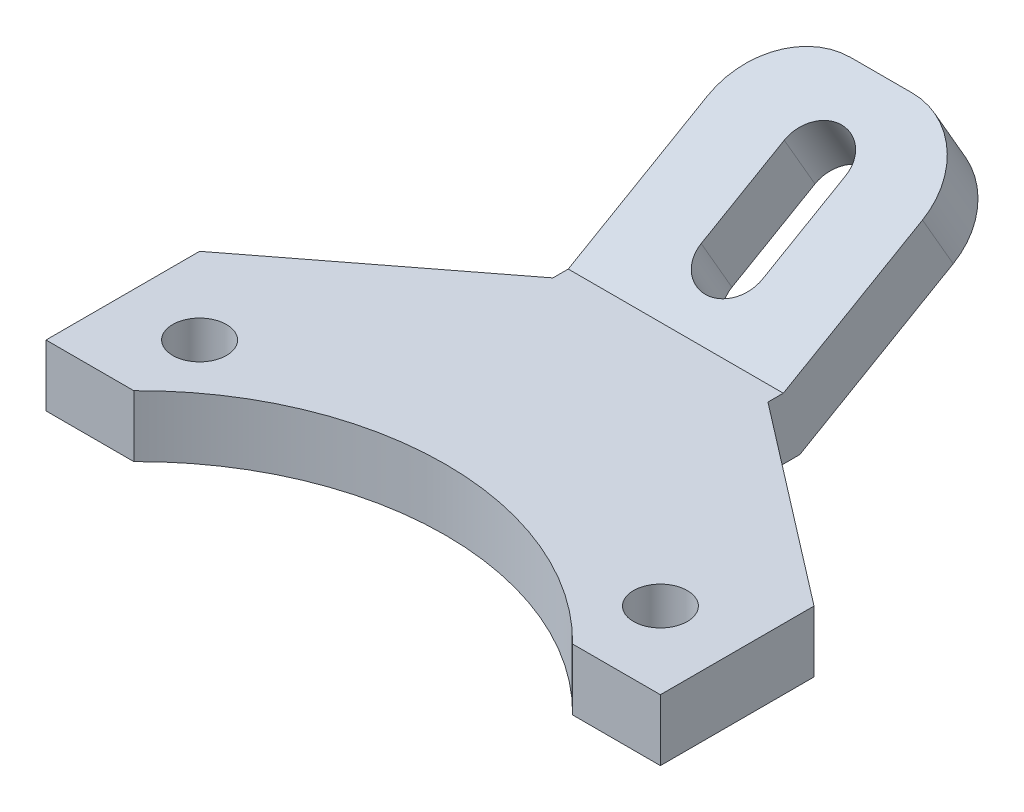
ISO-10303-21;
HEADER;
FILE_DESCRIPTION(('STEP AP214'),'2;1');
FILE_NAME('part.step','',(''),(''),'','','');
FILE_SCHEMA(('AUTOMOTIVE_DESIGN { 1 0 10303 214 1 1 1 1 }'));
ENDSEC;
DATA;
#1=APPLICATION_CONTEXT('core data for automotive mechanical design processes');
#2=APPLICATION_PROTOCOL_DEFINITION('international standard','automotive_design',2000,#1);
#3=PRODUCT_CONTEXT('',#1,'mechanical');
#4=PRODUCT('Part','Part','',(#3));
#5=PRODUCT_RELATED_PRODUCT_CATEGORY('part','',(#4));
#6=PRODUCT_DEFINITION_FORMATION('','',#4);
#7=PRODUCT_DEFINITION_CONTEXT('part definition',#1,'design');
#8=PRODUCT_DEFINITION('design','',#6,#7);
#9=PRODUCT_DEFINITION_SHAPE('','',#8);
#10=(LENGTH_UNIT() NAMED_UNIT(*) SI_UNIT(.MILLI.,.METRE.));
#11=(NAMED_UNIT(*) PLANE_ANGLE_UNIT() SI_UNIT($,.RADIAN.));
#12=(NAMED_UNIT(*) SI_UNIT($,.STERADIAN.) SOLID_ANGLE_UNIT());
#13=UNCERTAINTY_MEASURE_WITH_UNIT(LENGTH_MEASURE(1.E-05),#10,'distance_accuracy_value','');
#14=(GEOMETRIC_REPRESENTATION_CONTEXT(3) GLOBAL_UNCERTAINTY_ASSIGNED_CONTEXT((#13)) GLOBAL_UNIT_ASSIGNED_CONTEXT((#10,
#11,#12)) REPRESENTATION_CONTEXT('',''));
#15=CARTESIAN_POINT('',(0.,0.,0.));
#16=DIRECTION('',(0.,0.,1.));
#17=DIRECTION('',(1.,0.,0.));
#18=AXIS2_PLACEMENT_3D('',#15,#16,#17);
#19=CARTESIAN_POINT('',(27.,4.,0.));
#20=DIRECTION('',(-1.,0.,0.));
#21=DIRECTION('',(0.,0.,1.));
#22=AXIS2_PLACEMENT_3D('',#19,#20,#21);
#23=PLANE('',#22);
#24=DIRECTION('',(0.,-0.500000000000004,0.866025403784436));
#25=VECTOR('',#24,1.);
#26=CARTESIAN_POINT('',(27.,8.26794919243117,-36.3923048454132));
#27=LINE('',#26,#25);
#28=CARTESIAN_POINT('',(27.,5.76794919243115,-32.0621778264911));
#29=VERTEX_POINT('',#28);
#30=CARTESIAN_POINT('',(27.,0.,-22.0717967697245));
#31=VERTEX_POINT('',#30);
#32=EDGE_CURVE('E228',#29,#31,#27,.T.);
#33=ORIENTED_EDGE('',*,*,#32,.F.);
#34=DIRECTION('',(0.,0.866025403784436,0.500000000000004));
#35=VECTOR('',#34,1.);
#36=CARTESIAN_POINT('',(27.,9.2320508075689,-30.062177826491));
#37=LINE('',#36,#35);
#38=CARTESIAN_POINT('',(27.,9.2320508075689,-30.062177826491));
#39=VERTEX_POINT('',#38);
#40=EDGE_CURVE('E11',#29,#39,#37,.T.);
#41=ORIENTED_EDGE('',*,*,#40,.T.);
#42=DIRECTION('',(0.,-0.500000000000004,0.866025403784436));
#43=VECTOR('',#42,1.);
#44=CARTESIAN_POINT('',(27.,11.7320508075689,-34.3923048454132));
#45=LINE('',#44,#43);
#46=CARTESIAN_POINT('',(27.,4.,-21.));
#47=VERTEX_POINT('',#46);
#48=EDGE_CURVE('E225',#39,#47,#45,.T.);
#49=ORIENTED_EDGE('',*,*,#48,.T.);
#50=DIRECTION('',(0.,0.,-1.));
#51=VECTOR('',#50,1.);
#52=CARTESIAN_POINT('',(27.,4.,0.));
#53=LINE('',#52,#51);
#54=CARTESIAN_POINT('',(27.,4.,-20.));
#55=VERTEX_POINT('',#54);
#56=EDGE_CURVE('E258',#55,#47,#53,.T.);
#57=ORIENTED_EDGE('',*,*,#56,.F.);
#58=DIRECTION('',(0.,-1.,0.));
#59=VECTOR('',#58,1.);
#60=CARTESIAN_POINT('',(27.,4.,-20.));
#61=LINE('',#60,#59);
#62=CARTESIAN_POINT('',(27.,0.,-20.));
#63=VERTEX_POINT('',#62);
#64=EDGE_CURVE('E324',#55,#63,#61,.T.);
#65=ORIENTED_EDGE('',*,*,#64,.T.);
#66=DIRECTION('',(0.,0.,-1.));
#67=VECTOR('',#66,1.);
#68=CARTESIAN_POINT('',(27.,0.,0.));
#69=LINE('',#68,#67);
#70=EDGE_CURVE('E296',#63,#31,#69,.T.);
#71=ORIENTED_EDGE('',*,*,#70,.T.);
#72=EDGE_LOOP('',(#33,#41,#49,#57,#65,#71));
#73=FACE_BOUND('',#72,.T.);
#74=ADVANCED_FACE('F43',(#73),#23,.F.);
#75=CARTESIAN_POINT('',(13.,4.,0.));
#76=DIRECTION('',(-1.,0.,0.));
#77=DIRECTION('',(0.,0.,1.));
#78=AXIS2_PLACEMENT_3D('',#75,#76,#77);
#79=PLANE('',#78);
#80=DIRECTION('',(0.,-0.500000000000004,0.866025403784436));
#81=VECTOR('',#80,1.);
#82=CARTESIAN_POINT('',(13.,11.7320508075689,-34.3923048454132));
#83=LINE('',#82,#81);
#84=CARTESIAN_POINT('',(13.,9.2320508075689,-30.062177826491));
#85=VERTEX_POINT('',#84);
#86=CARTESIAN_POINT('',(13.,4.,-21.));
#87=VERTEX_POINT('',#86);
#88=EDGE_CURVE('E221',#85,#87,#83,.T.);
#89=ORIENTED_EDGE('',*,*,#88,.F.);
#90=DIRECTION('',(0.,-0.866025403784436,-0.500000000000004));
#91=VECTOR('',#90,1.);
#92=CARTESIAN_POINT('',(13.,18.3253175473056,-24.812177826491));
#93=LINE('',#92,#91);
#94=CARTESIAN_POINT('',(13.,5.76794919243115,-32.0621778264911));
#95=VERTEX_POINT('',#94);
#96=EDGE_CURVE('E356',#85,#95,#93,.T.);
#97=ORIENTED_EDGE('',*,*,#96,.T.);
#98=DIRECTION('',(0.,-0.500000000000004,0.866025403784436));
#99=VECTOR('',#98,1.);
#100=CARTESIAN_POINT('',(13.,8.26794919243117,-36.3923048454132));
#101=LINE('',#100,#99);
#102=CARTESIAN_POINT('',(13.,0.,-22.0717967697245));
#103=VERTEX_POINT('',#102);
#104=EDGE_CURVE('E220',#95,#103,#101,.T.);
#105=ORIENTED_EDGE('',*,*,#104,.T.);
#106=DIRECTION('',(0.,0.,-1.));
#107=VECTOR('',#106,1.);
#108=CARTESIAN_POINT('',(13.,0.,0.));
#109=LINE('',#108,#107);
#110=CARTESIAN_POINT('',(13.,0.,-20.));
#111=VERTEX_POINT('',#110);
#112=EDGE_CURVE('E300',#111,#103,#109,.T.);
#113=ORIENTED_EDGE('',*,*,#112,.F.);
#114=DIRECTION('',(0.,-1.,0.));
#115=VECTOR('',#114,1.);
#116=CARTESIAN_POINT('',(13.,4.,-20.));
#117=LINE('',#116,#115);
#118=CARTESIAN_POINT('',(13.,4.,-20.));
#119=VERTEX_POINT('',#118);
#120=EDGE_CURVE('E321',#119,#111,#117,.T.);
#121=ORIENTED_EDGE('',*,*,#120,.F.);
#122=DIRECTION('',(0.,0.,-1.));
#123=VECTOR('',#122,1.);
#124=CARTESIAN_POINT('',(13.,4.,0.));
#125=LINE('',#124,#123);
#126=EDGE_CURVE('E262',#119,#87,#125,.T.);
#127=ORIENTED_EDGE('',*,*,#126,.T.);
#128=EDGE_LOOP('',(#89,#97,#105,#113,#121,#127));
#129=FACE_BOUND('',#128,.T.);
#130=ADVANCED_FACE('F379',(#129),#79,.T.);
#131=CARTESIAN_POINT('',(0.,0.,0.));
#132=DIRECTION('',(0.,1.,0.));
#133=DIRECTION('',(0.,0.,1.));
#134=AXIS2_PLACEMENT_3D('',#131,#132,#133);
#135=PLANE('',#134);
#136=CARTESIAN_POINT('',(5.,0.,-5.));
#137=DIRECTION('',(0.,1.,0.));
#138=DIRECTION('',(0.,0.,1.));
#139=AXIS2_PLACEMENT_3D('',#136,#137,#138);
#140=CIRCLE('',#139,1.75);
#141=CARTESIAN_POINT('',(5.,0.,-3.25));
#142=VERTEX_POINT('',#141);
#143=EDGE_CURVE('E276',#142,#142,#140,.T.);
#144=ORIENTED_EDGE('',*,*,#143,.T.);
#145=EDGE_LOOP('',(#144));
#146=FACE_BOUND('',#145,.T.);
#147=CARTESIAN_POINT('',(35.,0.,-5.));
#148=DIRECTION('',(0.,1.,0.));
#149=DIRECTION('',(0.,0.,1.));
#150=AXIS2_PLACEMENT_3D('',#147,#148,#149);
#151=CIRCLE('',#150,1.75);
#152=CARTESIAN_POINT('',(35.,0.,-3.25));
#153=VERTEX_POINT('',#152);
#154=EDGE_CURVE('E224',#153,#153,#151,.T.);
#155=ORIENTED_EDGE('',*,*,#154,.T.);
#156=EDGE_LOOP('',(#155));
#157=FACE_BOUND('',#156,.T.);
#158=DIRECTION('',(-1.,0.,0.));
#159=VECTOR('',#158,1.);
#160=CARTESIAN_POINT('',(0.,0.,-22.0717967697245));
#161=LINE('',#160,#159);
#162=EDGE_CURVE('E341',#31,#103,#161,.T.);
#163=ORIENTED_EDGE('',*,*,#162,.F.);
#164=ORIENTED_EDGE('',*,*,#70,.F.);
#165=DIRECTION('',(0.7926239891046,0.,0.609710760849692));
#166=VECTOR('',#165,1.);
#167=CARTESIAN_POINT('',(19.7026022304833,0.,-25.6133828996283));
#168=LINE('',#167,#166);
#169=CARTESIAN_POINT('',(40.,0.,-10.));
#170=VERTEX_POINT('',#169);
#171=EDGE_CURVE('E292',#63,#170,#168,.T.);
#172=ORIENTED_EDGE('',*,*,#171,.T.);
#173=DIRECTION('',(0.,0.,-1.));
#174=VECTOR('',#173,1.);
#175=CARTESIAN_POINT('',(40.,0.,0.));
#176=LINE('',#175,#174);
#177=CARTESIAN_POINT('',(40.,0.,0.));
#178=VERTEX_POINT('',#177);
#179=EDGE_CURVE('E288',#178,#170,#176,.T.);
#180=ORIENTED_EDGE('',*,*,#179,.F.);
#181=DIRECTION('',(1.,0.,0.));
#182=VECTOR('',#181,1.);
#183=CARTESIAN_POINT('',(0.,0.,0.));
#184=LINE('',#183,#182);
#185=CARTESIAN_POINT('',(34.2828568570857,0.,0.));
#186=VERTEX_POINT('',#185);
#187=EDGE_CURVE('E284',#186,#178,#184,.T.);
#188=ORIENTED_EDGE('',*,*,#187,.F.);
#189=CARTESIAN_POINT('',(20.,0.,14.));
#190=DIRECTION('',(0.,1.,0.));
#191=DIRECTION('',(0.,0.,1.));
#192=AXIS2_PLACEMENT_3D('',#189,#190,#191);
#193=CIRCLE('',#192,20.);
#194=CARTESIAN_POINT('',(5.71714314291429,0.,0.));
#195=VERTEX_POINT('',#194);
#196=EDGE_CURVE('E280',#186,#195,#193,.T.);
#197=ORIENTED_EDGE('',*,*,#196,.T.);
#198=CARTESIAN_POINT('',(0.,0.,0.));
#199=VERTEX_POINT('',#198);
#200=EDGE_CURVE('E238',#199,#195,#184,.T.);
#201=ORIENTED_EDGE('',*,*,#200,.F.);
#202=DIRECTION('',(0.,0.,-1.));
#203=VECTOR('',#202,1.);
#204=CARTESIAN_POINT('',(0.,0.,0.));
#205=LINE('',#204,#203);
#206=CARTESIAN_POINT('',(0.,0.,-10.));
#207=VERTEX_POINT('',#206);
#208=EDGE_CURVE('E308',#199,#207,#205,.T.);
#209=ORIENTED_EDGE('',*,*,#208,.T.);
#210=DIRECTION('',(-0.7926239891046,0.,0.609710760849692));
#211=VECTOR('',#210,1.);
#212=CARTESIAN_POINT('',(-4.83271375464684,0.,-6.28252788104089));
#213=LINE('',#212,#211);
#214=EDGE_CURVE('E304',#111,#207,#213,.T.);
#215=ORIENTED_EDGE('',*,*,#214,.F.);
#216=ORIENTED_EDGE('',*,*,#112,.T.);
#217=EDGE_LOOP('',(#163,#164,#172,#180,#188,#197,#201,#209,#215,#216));
#218=FACE_BOUND('',#217,.T.);
#219=ADVANCED_FACE('F395',(#146,#157,#218),#135,.F.);
#220=CARTESIAN_POINT('',(20.,4.,14.));
#221=DIRECTION('',(0.,-1.,0.));
#222=DIRECTION('',(0.,0.,-1.));
#223=AXIS2_PLACEMENT_3D('',#220,#221,#222);
#224=CYLINDRICAL_SURFACE('',#223,20.);
#225=ORIENTED_EDGE('',*,*,#196,.F.);
#226=DIRECTION('',(0.,-1.,0.));
#227=VECTOR('',#226,1.);
#228=CARTESIAN_POINT('',(34.2828568570857,4.,0.));
#229=LINE('',#228,#227);
#230=CARTESIAN_POINT('',(34.2828568570857,4.,0.));
#231=VERTEX_POINT('',#230);
#232=EDGE_CURVE('E334',#231,#186,#229,.T.);
#233=ORIENTED_EDGE('',*,*,#232,.F.);
#234=CARTESIAN_POINT('',(20.,4.,14.));
#235=DIRECTION('',(0.,1.,0.));
#236=DIRECTION('',(0.,0.,1.));
#237=AXIS2_PLACEMENT_3D('',#234,#235,#236);
#238=CIRCLE('',#237,20.);
#239=CARTESIAN_POINT('',(5.71714314291429,4.,0.));
#240=VERTEX_POINT('',#239);
#241=EDGE_CURVE('E242',#231,#240,#238,.T.);
#242=ORIENTED_EDGE('',*,*,#241,.T.);
#243=DIRECTION('',(0.,-1.,0.));
#244=VECTOR('',#243,1.);
#245=CARTESIAN_POINT('',(5.71714314291429,4.,0.));
#246=LINE('',#245,#244);
#247=EDGE_CURVE('E312',#240,#195,#246,.T.);
#248=ORIENTED_EDGE('',*,*,#247,.T.);
#249=EDGE_LOOP('',(#225,#233,#242,#248));
#250=FACE_BOUND('',#249,.T.);
#251=ADVANCED_FACE('F408',(#250),#224,.F.);
#252=CARTESIAN_POINT('',(0.,4.,0.));
#253=DIRECTION('',(0.,0.,-1.));
#254=DIRECTION('',(-1.,0.,0.));
#255=AXIS2_PLACEMENT_3D('',#252,#253,#254);
#256=PLANE('',#255);
#257=ORIENTED_EDGE('',*,*,#187,.T.);
#258=DIRECTION('',(0.,-1.,0.));
#259=VECTOR('',#258,1.);
#260=CARTESIAN_POINT('',(40.,4.,0.));
#261=LINE('',#260,#259);
#262=CARTESIAN_POINT('',(40.,4.,0.));
#263=VERTEX_POINT('',#262);
#264=EDGE_CURVE('E330',#263,#178,#261,.T.);
#265=ORIENTED_EDGE('',*,*,#264,.F.);
#266=DIRECTION('',(1.,0.,0.));
#267=VECTOR('',#266,1.);
#268=CARTESIAN_POINT('',(0.,4.,0.));
#269=LINE('',#268,#267);
#270=EDGE_CURVE('E246',#231,#263,#269,.T.);
#271=ORIENTED_EDGE('',*,*,#270,.F.);
#272=ORIENTED_EDGE('',*,*,#232,.T.);
#273=EDGE_LOOP('',(#257,#265,#271,#272));
#274=FACE_BOUND('',#273,.T.);
#275=ADVANCED_FACE('F431',(#274),#256,.F.);
#276=CARTESIAN_POINT('',(40.,4.,0.));
#277=DIRECTION('',(-1.,0.,0.));
#278=DIRECTION('',(0.,0.,1.));
#279=AXIS2_PLACEMENT_3D('',#276,#277,#278);
#280=PLANE('',#279);
#281=ORIENTED_EDGE('',*,*,#179,.T.);
#282=DIRECTION('',(0.,-1.,0.));
#283=VECTOR('',#282,1.);
#284=CARTESIAN_POINT('',(40.,4.,-10.));
#285=LINE('',#284,#283);
#286=CARTESIAN_POINT('',(40.,4.,-10.));
#287=VERTEX_POINT('',#286);
#288=EDGE_CURVE('E327',#287,#170,#285,.T.);
#289=ORIENTED_EDGE('',*,*,#288,.F.);
#290=DIRECTION('',(0.,0.,-1.));
#291=VECTOR('',#290,1.);
#292=CARTESIAN_POINT('',(40.,4.,0.));
#293=LINE('',#292,#291);
#294=EDGE_CURVE('E250',#263,#287,#293,.T.);
#295=ORIENTED_EDGE('',*,*,#294,.F.);
#296=ORIENTED_EDGE('',*,*,#264,.T.);
#297=EDGE_LOOP('',(#281,#289,#295,#296));
#298=FACE_BOUND('',#297,.T.);
#299=ADVANCED_FACE('F401',(#298),#280,.F.);
#300=CARTESIAN_POINT('',(19.7026022304833,4.,-25.6133828996283));
#301=DIRECTION('',(0.609710760849692,0.,-0.7926239891046));
#302=DIRECTION('',(-0.7926239891046,0.,-0.609710760849692));
#303=AXIS2_PLACEMENT_3D('',#300,#301,#302);
#304=PLANE('',#303);
#305=ORIENTED_EDGE('',*,*,#171,.F.);
#306=ORIENTED_EDGE('',*,*,#64,.F.);
#307=DIRECTION('',(0.7926239891046,0.,0.609710760849692));
#308=VECTOR('',#307,1.);
#309=CARTESIAN_POINT('',(19.7026022304833,4.,-25.6133828996283));
#310=LINE('',#309,#308);
#311=EDGE_CURVE('E254',#55,#287,#310,.T.);
#312=ORIENTED_EDGE('',*,*,#311,.T.);
#313=ORIENTED_EDGE('',*,*,#288,.T.);
#314=EDGE_LOOP('',(#305,#306,#312,#313));
#315=FACE_BOUND('',#314,.T.);
#316=ADVANCED_FACE('F397',(#315),#304,.T.);
#317=CARTESIAN_POINT('',(-4.83271375464684,4.,-6.28252788104089));
#318=DIRECTION('',(0.609710760849692,0.,0.7926239891046));
#319=DIRECTION('',(0.7926239891046,0.,-0.609710760849692));
#320=AXIS2_PLACEMENT_3D('',#317,#318,#319);
#321=PLANE('',#320);
#322=ORIENTED_EDGE('',*,*,#214,.T.);
#323=DIRECTION('',(0.,-1.,0.));
#324=VECTOR('',#323,1.);
#325=CARTESIAN_POINT('',(0.,4.,-10.));
#326=LINE('',#325,#324);
#327=CARTESIAN_POINT('',(0.,4.,-10.));
#328=VERTEX_POINT('',#327);
#329=EDGE_CURVE('E318',#328,#207,#326,.T.);
#330=ORIENTED_EDGE('',*,*,#329,.F.);
#331=DIRECTION('',(-0.7926239891046,0.,0.609710760849692));
#332=VECTOR('',#331,1.);
#333=CARTESIAN_POINT('',(-4.83271375464684,4.,-6.28252788104089));
#334=LINE('',#333,#332);
#335=EDGE_CURVE('E266',#119,#328,#334,.T.);
#336=ORIENTED_EDGE('',*,*,#335,.F.);
#337=ORIENTED_EDGE('',*,*,#120,.T.);
#338=EDGE_LOOP('',(#322,#330,#336,#337));
#339=FACE_BOUND('',#338,.T.);
#340=ADVANCED_FACE('F430',(#339),#321,.F.);
#341=CARTESIAN_POINT('',(0.,4.,0.));
#342=DIRECTION('',(-1.,0.,0.));
#343=DIRECTION('',(0.,0.,1.));
#344=AXIS2_PLACEMENT_3D('',#341,#342,#343);
#345=PLANE('',#344);
#346=ORIENTED_EDGE('',*,*,#208,.F.);
#347=DIRECTION('',(0.,-1.,0.));
#348=VECTOR('',#347,1.);
#349=CARTESIAN_POINT('',(0.,4.,0.));
#350=LINE('',#349,#348);
#351=CARTESIAN_POINT('',(0.,4.,0.));
#352=VERTEX_POINT('',#351);
#353=EDGE_CURVE('E315',#352,#199,#350,.T.);
#354=ORIENTED_EDGE('',*,*,#353,.F.);
#355=DIRECTION('',(0.,0.,-1.));
#356=VECTOR('',#355,1.);
#357=CARTESIAN_POINT('',(0.,4.,0.));
#358=LINE('',#357,#356);
#359=EDGE_CURVE('E269',#352,#328,#358,.T.);
#360=ORIENTED_EDGE('',*,*,#359,.T.);
#361=ORIENTED_EDGE('',*,*,#329,.T.);
#362=EDGE_LOOP('',(#346,#354,#360,#361));
#363=FACE_BOUND('',#362,.T.);
#364=ADVANCED_FACE('F426',(#363),#345,.T.);
#365=CARTESIAN_POINT('',(5.,4.,-5.));
#366=DIRECTION('',(0.,-1.,0.));
#367=DIRECTION('',(0.,0.,-1.));
#368=AXIS2_PLACEMENT_3D('',#365,#366,#367);
#369=CYLINDRICAL_SURFACE('',#368,1.75);
#370=CARTESIAN_POINT('',(5.,4.,-5.));
#371=DIRECTION('',(0.,1.,0.));
#372=DIRECTION('',(0.,0.,1.));
#373=AXIS2_PLACEMENT_3D('',#370,#371,#372);
#374=CIRCLE('',#373,1.75);
#375=CARTESIAN_POINT('',(5.,4.,-3.25));
#376=VERTEX_POINT('',#375);
#377=EDGE_CURVE('E237',#376,#376,#374,.T.);
#378=ORIENTED_EDGE('',*,*,#377,.T.);
#379=EDGE_LOOP('',(#378));
#380=FACE_BOUND('',#379,.T.);
#381=ORIENTED_EDGE('',*,*,#143,.F.);
#382=EDGE_LOOP('',(#381));
#383=FACE_BOUND('',#382,.T.);
#384=ADVANCED_FACE('F454',(#380,#383),#369,.F.);
#385=CARTESIAN_POINT('',(35.,4.,-5.));
#386=DIRECTION('',(0.,-1.,0.));
#387=DIRECTION('',(0.,0.,-1.));
#388=AXIS2_PLACEMENT_3D('',#385,#386,#387);
#389=CYLINDRICAL_SURFACE('',#388,1.75);
#390=CARTESIAN_POINT('',(35.,4.,-5.));
#391=DIRECTION('',(0.,1.,0.));
#392=DIRECTION('',(0.,0.,1.));
#393=AXIS2_PLACEMENT_3D('',#390,#391,#392);
#394=CIRCLE('',#393,1.75);
#395=CARTESIAN_POINT('',(35.,4.,-3.25));
#396=VERTEX_POINT('',#395);
#397=EDGE_CURVE('E233',#396,#396,#394,.T.);
#398=ORIENTED_EDGE('',*,*,#397,.T.);
#399=EDGE_LOOP('',(#398));
#400=FACE_BOUND('',#399,.T.);
#401=ORIENTED_EDGE('',*,*,#154,.F.);
#402=EDGE_LOOP('',(#401));
#403=FACE_BOUND('',#402,.T.);
#404=ADVANCED_FACE('F443',(#400,#403),#389,.F.);
#405=ORIENTED_EDGE('',*,*,#200,.T.);
#406=ORIENTED_EDGE('',*,*,#247,.F.);
#407=EDGE_CURVE('E251',#352,#240,#269,.T.);
#408=ORIENTED_EDGE('',*,*,#407,.F.);
#409=ORIENTED_EDGE('',*,*,#353,.T.);
#410=EDGE_LOOP('',(#405,#406,#408,#409));
#411=FACE_BOUND('',#410,.T.);
#412=ADVANCED_FACE('F415',(#411),#256,.F.);
#413=CARTESIAN_POINT('',(0.,4.,0.));
#414=DIRECTION('',(0.,1.,0.));
#415=DIRECTION('',(0.,0.,1.));
#416=AXIS2_PLACEMENT_3D('',#413,#414,#415);
#417=PLANE('',#416);
#418=DIRECTION('',(1.,0.,0.));
#419=VECTOR('',#418,1.);
#420=CARTESIAN_POINT('',(0.,4.,-21.));
#421=LINE('',#420,#419);
#422=EDGE_CURVE('E337',#87,#47,#421,.T.);
#423=ORIENTED_EDGE('',*,*,#422,.F.);
#424=ORIENTED_EDGE('',*,*,#126,.F.);
#425=ORIENTED_EDGE('',*,*,#335,.T.);
#426=ORIENTED_EDGE('',*,*,#359,.F.);
#427=ORIENTED_EDGE('',*,*,#407,.T.);
#428=ORIENTED_EDGE('',*,*,#241,.F.);
#429=ORIENTED_EDGE('',*,*,#270,.T.);
#430=ORIENTED_EDGE('',*,*,#294,.T.);
#431=ORIENTED_EDGE('',*,*,#311,.F.);
#432=ORIENTED_EDGE('',*,*,#56,.T.);
#433=EDGE_LOOP('',(#423,#424,#425,#426,#427,#428,#429,#430,#431,#432));
#434=FACE_BOUND('',#433,.T.);
#435=ORIENTED_EDGE('',*,*,#397,.F.);
#436=EDGE_LOOP('',(#435));
#437=FACE_BOUND('',#436,.T.);
#438=ORIENTED_EDGE('',*,*,#377,.F.);
#439=EDGE_LOOP('',(#438));
#440=FACE_BOUND('',#439,.T.);
#441=ADVANCED_FACE('F421',(#434,#437,#440),#417,.T.);
#442=CARTESIAN_POINT('',(13.,11.7320508075689,-34.3923048454132));
#443=DIRECTION('',(0.,0.866025403784436,0.500000000000004));
#444=DIRECTION('',(0.,-0.500000000000004,0.866025403784436));
#445=AXIS2_PLACEMENT_3D('',#442,#443,#444);
#446=PLANE('',#445);
#447=CARTESIAN_POINT('',(20.,6.11050204627201,-24.6554967736212));
#448=DIRECTION('',(0.,0.866025403784436,0.500000000000004));
#449=DIRECTION('',(0.,-0.500000000000004,0.866025403784436));
#450=AXIS2_PLACEMENT_3D('',#447,#448,#449);
#451=CIRCLE('',#450,2.);
#452=CARTESIAN_POINT('',(18.,6.11050204627201,-24.6554967736212));
#453=VERTEX_POINT('',#452);
#454=CARTESIAN_POINT('',(22.,6.110502046272,-24.6554967736212));
#455=VERTEX_POINT('',#454);
#456=EDGE_CURVE('E194',#453,#455,#451,.T.);
#457=ORIENTED_EDGE('',*,*,#456,.F.);
#458=DIRECTION('',(0.,-0.500000000000004,0.866025403784436));
#459=VECTOR('',#458,1.);
#460=CARTESIAN_POINT('',(18.,6.11050204627201,-24.6554967736212));
#461=LINE('',#460,#459);
#462=CARTESIAN_POINT('',(18.,9.2320508075689,-30.062177826491));
#463=VERTEX_POINT('',#462);
#464=EDGE_CURVE('E199',#463,#453,#461,.T.);
#465=ORIENTED_EDGE('',*,*,#464,.F.);
#466=CARTESIAN_POINT('',(20.,9.2320508075689,-30.062177826491));
#467=DIRECTION('',(0.,0.866025403784436,0.500000000000004));
#468=DIRECTION('',(0.,-0.500000000000004,0.866025403784436));
#469=AXIS2_PLACEMENT_3D('',#466,#467,#468);
#470=CIRCLE('',#469,2.);
#471=CARTESIAN_POINT('',(22.,9.2320508075689,-30.062177826491));
#472=VERTEX_POINT('',#471);
#473=EDGE_CURVE('E176',#472,#463,#470,.T.);
#474=ORIENTED_EDGE('',*,*,#473,.F.);
#475=DIRECTION('',(0.,0.500000000000004,-0.866025403784436));
#476=VECTOR('',#475,1.);
#477=CARTESIAN_POINT('',(22.,6.11050204627201,-24.6554967736212));
#478=LINE('',#477,#476);
#479=EDGE_CURVE('E188',#455,#472,#478,.T.);
#480=ORIENTED_EDGE('',*,*,#479,.F.);
#481=EDGE_LOOP('',(#457,#465,#474,#480));
#482=FACE_BOUND('',#481,.T.);
#483=DIRECTION('',(-1.,0.,0.));
#484=VECTOR('',#483,1.);
#485=CARTESIAN_POINT('',(13.,11.7320508075689,-34.3923048454132));
#486=LINE('',#485,#484);
#487=CARTESIAN_POINT('',(22.,11.7320508075689,-34.3923048454132));
#488=VERTEX_POINT('',#487);
#489=CARTESIAN_POINT('',(18.,11.7320508075689,-34.3923048454132));
#490=VERTEX_POINT('',#489);
#491=EDGE_CURVE('E217',#488,#490,#486,.T.);
#492=ORIENTED_EDGE('',*,*,#491,.T.);
#493=CARTESIAN_POINT('',(18.,9.2320508075689,-30.062177826491));
#494=DIRECTION('',(0.,0.866025403784436,0.500000000000004));
#495=DIRECTION('',(0.,-0.500000000000004,0.866025403784436));
#496=AXIS2_PLACEMENT_3D('',#493,#494,#495);
#497=CIRCLE('',#496,5.);
#498=EDGE_CURVE('E52',#490,#85,#497,.T.);
#499=ORIENTED_EDGE('',*,*,#498,.T.);
#500=ORIENTED_EDGE('',*,*,#88,.T.);
#501=ORIENTED_EDGE('',*,*,#422,.T.);
#502=ORIENTED_EDGE('',*,*,#48,.F.);
#503=CARTESIAN_POINT('',(22.,9.2320508075689,-30.062177826491));
#504=DIRECTION('',(0.,0.866025403784436,0.500000000000004));
#505=DIRECTION('',(0.,-0.500000000000004,0.866025403784436));
#506=AXIS2_PLACEMENT_3D('',#503,#504,#505);
#507=CIRCLE('',#506,5.);
#508=EDGE_CURVE('E59',#39,#488,#507,.T.);
#509=ORIENTED_EDGE('',*,*,#508,.T.);
#510=EDGE_LOOP('',(#492,#499,#500,#501,#502,#509));
#511=FACE_BOUND('',#510,.T.);
#512=ADVANCED_FACE('F196',(#482,#511),#446,.T.);
#513=CARTESIAN_POINT('',(13.,8.26794919243117,-36.3923048454132));
#514=DIRECTION('',(0.,-0.866025403784436,-0.500000000000004));
#515=DIRECTION('',(0.,0.500000000000004,-0.866025403784436));
#516=AXIS2_PLACEMENT_3D('',#513,#514,#515);
#517=PLANE('',#516);
#518=CARTESIAN_POINT('',(20.,2.64640043113426,-26.6554967736212));
#519=DIRECTION('',(0.,-0.866025403784436,-0.500000000000004));
#520=DIRECTION('',(0.,0.500000000000004,-0.866025403784436));
#521=AXIS2_PLACEMENT_3D('',#518,#519,#520);
#522=CIRCLE('',#521,2.);
#523=CARTESIAN_POINT('',(22.,2.64640043113426,-26.6554967736212));
#524=VERTEX_POINT('',#523);
#525=CARTESIAN_POINT('',(18.,2.64640043113426,-26.6554967736212));
#526=VERTEX_POINT('',#525);
#527=EDGE_CURVE('E353',#524,#526,#522,.T.);
#528=ORIENTED_EDGE('',*,*,#527,.F.);
#529=DIRECTION('',(0.,-0.500000000000004,0.866025403784436));
#530=VECTOR('',#529,1.);
#531=CARTESIAN_POINT('',(22.,8.26794919243117,-36.3923048454132));
#532=LINE('',#531,#530);
#533=CARTESIAN_POINT('',(22.,5.76794919243116,-32.0621778264911));
#534=VERTEX_POINT('',#533);
#535=EDGE_CURVE('E345',#534,#524,#532,.T.);
#536=ORIENTED_EDGE('',*,*,#535,.F.);
#537=CARTESIAN_POINT('',(20.,5.76794919243116,-32.0621778264911));
#538=DIRECTION('',(0.,-0.866025403784436,-0.500000000000004));
#539=DIRECTION('',(0.,0.500000000000004,-0.866025403784436));
#540=AXIS2_PLACEMENT_3D('',#537,#538,#539);
#541=CIRCLE('',#540,2.);
#542=CARTESIAN_POINT('',(18.,5.76794919243116,-32.0621778264911));
#543=VERTEX_POINT('',#542);
#544=EDGE_CURVE('E179',#543,#534,#541,.T.);
#545=ORIENTED_EDGE('',*,*,#544,.F.);
#546=DIRECTION('',(0.,0.500000000000004,-0.866025403784436));
#547=VECTOR('',#546,1.);
#548=CARTESIAN_POINT('',(18.,8.26794919243117,-36.3923048454132));
#549=LINE('',#548,#547);
#550=EDGE_CURVE('E350',#526,#543,#549,.T.);
#551=ORIENTED_EDGE('',*,*,#550,.F.);
#552=EDGE_LOOP('',(#528,#536,#545,#551));
#553=FACE_BOUND('',#552,.T.);
#554=ORIENTED_EDGE('',*,*,#104,.F.);
#555=CARTESIAN_POINT('',(18.,5.76794919243115,-32.0621778264911));
#556=DIRECTION('',(0.,-0.866025403784436,-0.500000000000004));
#557=DIRECTION('',(0.,0.500000000000004,-0.866025403784436));
#558=AXIS2_PLACEMENT_3D('',#555,#556,#557);
#559=CIRCLE('',#558,5.);
#560=CARTESIAN_POINT('',(18.,8.26794919243117,-36.3923048454132));
#561=VERTEX_POINT('',#560);
#562=EDGE_CURVE('E363',#95,#561,#559,.T.);
#563=ORIENTED_EDGE('',*,*,#562,.T.);
#564=DIRECTION('',(1.,0.,0.));
#565=VECTOR('',#564,1.);
#566=CARTESIAN_POINT('',(13.,8.26794919243117,-36.3923048454132));
#567=LINE('',#566,#565);
#568=CARTESIAN_POINT('',(22.,8.26794919243117,-36.3923048454132));
#569=VERTEX_POINT('',#568);
#570=EDGE_CURVE('E209',#561,#569,#567,.T.);
#571=ORIENTED_EDGE('',*,*,#570,.T.);
#572=CARTESIAN_POINT('',(22.,5.76794919243115,-32.0621778264911));
#573=DIRECTION('',(0.,-0.866025403784436,-0.500000000000004));
#574=DIRECTION('',(0.,0.500000000000004,-0.866025403784436));
#575=AXIS2_PLACEMENT_3D('',#572,#573,#574);
#576=CIRCLE('',#575,5.);
#577=EDGE_CURVE('E360',#569,#29,#576,.T.);
#578=ORIENTED_EDGE('',*,*,#577,.T.);
#579=ORIENTED_EDGE('',*,*,#32,.T.);
#580=ORIENTED_EDGE('',*,*,#162,.T.);
#581=EDGE_LOOP('',(#554,#563,#571,#578,#579,#580));
#582=FACE_BOUND('',#581,.T.);
#583=ADVANCED_FACE('F384',(#553,#582),#517,.T.);
#584=CARTESIAN_POINT('',(0.,17.8253175473056,-30.874355652982));
#585=DIRECTION('',(0.,0.500000000000004,-0.866025403784436));
#586=DIRECTION('',(0.,0.866025403784436,0.500000000000004));
#587=AXIS2_PLACEMENT_3D('',#584,#585,#586);
#588=PLANE('',#587);
#589=ORIENTED_EDGE('',*,*,#570,.F.);
#590=DIRECTION('',(0.,-0.866025403784436,-0.500000000000004));
#591=VECTOR('',#590,1.);
#592=CARTESIAN_POINT('',(18.,17.8253175473056,-30.874355652982));
#593=LINE('',#592,#591);
#594=EDGE_CURVE('E66',#561,#490,#593,.F.);
#595=ORIENTED_EDGE('',*,*,#594,.T.);
#596=ORIENTED_EDGE('',*,*,#491,.F.);
#597=DIRECTION('',(0.,0.866025403784436,0.500000000000004));
#598=VECTOR('',#597,1.);
#599=CARTESIAN_POINT('',(22.,8.26794919243117,-36.3923048454132));
#600=LINE('',#599,#598);
#601=EDGE_CURVE('E366',#488,#569,#600,.F.);
#602=ORIENTED_EDGE('',*,*,#601,.T.);
#603=EDGE_LOOP('',(#589,#595,#596,#602));
#604=FACE_BOUND('',#603,.T.);
#605=ADVANCED_FACE('F386',(#604),#588,.T.);
#606=CARTESIAN_POINT('',(20.,-6.0138536067101,-31.6554967736212));
#607=DIRECTION('',(0.,0.866025403784436,0.500000000000004));
#608=DIRECTION('',(0.,-0.500000000000004,0.866025403784436));
#609=AXIS2_PLACEMENT_3D('',#606,#607,#608);
#610=CYLINDRICAL_SURFACE('',#609,2.);
#611=ORIENTED_EDGE('',*,*,#527,.T.);
#612=DIRECTION('',(0.,0.866025403784436,0.500000000000004));
#613=VECTOR('',#612,1.);
#614=CARTESIAN_POINT('',(18.,-6.0138536067101,-31.6554967736212));
#615=LINE('',#614,#613);
#616=EDGE_CURVE('E206',#526,#453,#615,.T.);
#617=ORIENTED_EDGE('',*,*,#616,.T.);
#618=ORIENTED_EDGE('',*,*,#456,.T.);
#619=DIRECTION('',(0.,0.866025403784436,0.500000000000004));
#620=VECTOR('',#619,1.);
#621=CARTESIAN_POINT('',(22.,-6.0138536067101,-31.6554967736212));
#622=LINE('',#621,#620);
#623=EDGE_CURVE('E184',#524,#455,#622,.T.);
#624=ORIENTED_EDGE('',*,*,#623,.F.);
#625=EDGE_LOOP('',(#611,#617,#618,#624));
#626=FACE_BOUND('',#625,.T.);
#627=ADVANCED_FACE('F473',(#626),#610,.F.);
#628=CARTESIAN_POINT('',(18.,-6.0138536067101,-31.6554967736212));
#629=DIRECTION('',(-1.,0.,0.));
#630=DIRECTION('',(0.,0.,1.));
#631=AXIS2_PLACEMENT_3D('',#628,#629,#630);
#632=PLANE('',#631);
#633=ORIENTED_EDGE('',*,*,#550,.T.);
#634=DIRECTION('',(0.,0.866025403784436,0.500000000000004));
#635=VECTOR('',#634,1.);
#636=CARTESIAN_POINT('',(18.,-2.89230484541321,-37.0621778264911));
#637=LINE('',#636,#635);
#638=EDGE_CURVE('E183',#543,#463,#637,.T.);
#639=ORIENTED_EDGE('',*,*,#638,.T.);
#640=ORIENTED_EDGE('',*,*,#464,.T.);
#641=ORIENTED_EDGE('',*,*,#616,.F.);
#642=EDGE_LOOP('',(#633,#639,#640,#641));
#643=FACE_BOUND('',#642,.T.);
#644=ADVANCED_FACE('F469',(#643),#632,.F.);
#645=CARTESIAN_POINT('',(20.,-2.89230484541321,-37.0621778264911));
#646=DIRECTION('',(0.,0.866025403784436,0.500000000000004));
#647=DIRECTION('',(0.,-0.500000000000004,0.866025403784436));
#648=AXIS2_PLACEMENT_3D('',#645,#646,#647);
#649=CYLINDRICAL_SURFACE('',#648,2.);
#650=ORIENTED_EDGE('',*,*,#544,.T.);
#651=DIRECTION('',(0.,0.866025403784436,0.500000000000004));
#652=VECTOR('',#651,1.);
#653=CARTESIAN_POINT('',(22.,-2.89230484541321,-37.0621778264911));
#654=LINE('',#653,#652);
#655=EDGE_CURVE('E171',#534,#472,#654,.T.);
#656=ORIENTED_EDGE('',*,*,#655,.T.);
#657=ORIENTED_EDGE('',*,*,#473,.T.);
#658=ORIENTED_EDGE('',*,*,#638,.F.);
#659=EDGE_LOOP('',(#650,#656,#657,#658));
#660=FACE_BOUND('',#659,.T.);
#661=ADVANCED_FACE('F173',(#660),#649,.F.);
#662=CARTESIAN_POINT('',(22.,-6.0138536067101,-31.6554967736212));
#663=DIRECTION('',(1.,0.,0.));
#664=DIRECTION('',(0.,0.,-1.));
#665=AXIS2_PLACEMENT_3D('',#662,#663,#664);
#666=PLANE('',#665);
#667=ORIENTED_EDGE('',*,*,#535,.T.);
#668=ORIENTED_EDGE('',*,*,#623,.T.);
#669=ORIENTED_EDGE('',*,*,#479,.T.);
#670=ORIENTED_EDGE('',*,*,#655,.F.);
#671=EDGE_LOOP('',(#667,#668,#669,#670));
#672=FACE_BOUND('',#671,.T.);
#673=ADVANCED_FACE('F189',(#672),#666,.F.);
#674=CARTESIAN_POINT('',(18.,18.3253175473056,-24.812177826491));
#675=DIRECTION('',(0.,-0.866025403784436,-0.500000000000004));
#676=DIRECTION('',(0.,0.500000000000004,-0.866025403784436));
#677=AXIS2_PLACEMENT_3D('',#674,#675,#676);
#678=CYLINDRICAL_SURFACE('',#677,5.);
#679=ORIENTED_EDGE('',*,*,#498,.F.);
#680=ORIENTED_EDGE('',*,*,#594,.F.);
#681=ORIENTED_EDGE('',*,*,#562,.F.);
#682=ORIENTED_EDGE('',*,*,#96,.F.);
#683=EDGE_LOOP('',(#679,#680,#681,#682));
#684=FACE_BOUND('',#683,.T.);
#685=ADVANCED_FACE('F382',(#684),#678,.T.);
#686=CARTESIAN_POINT('',(22.,18.3253175473056,-24.812177826491));
#687=DIRECTION('',(0.,-0.866025403784436,-0.500000000000004));
#688=DIRECTION('',(0.,0.500000000000004,-0.866025403784436));
#689=AXIS2_PLACEMENT_3D('',#686,#687,#688);
#690=CYLINDRICAL_SURFACE('',#689,5.);
#691=ORIENTED_EDGE('',*,*,#577,.F.);
#692=ORIENTED_EDGE('',*,*,#601,.F.);
#693=ORIENTED_EDGE('',*,*,#508,.F.);
#694=ORIENTED_EDGE('',*,*,#40,.F.);
#695=EDGE_LOOP('',(#691,#692,#693,#694));
#696=FACE_BOUND('',#695,.T.);
#697=ADVANCED_FACE('F45',(#696),#690,.T.);
#698=CLOSED_SHELL('',(#74,#130,#219,#251,#275,#299,#316,#340,#364,#384,#404,#412,#441,#512,#583,
#605,#627,#644,#661,#673,#685,#697));
#699=MANIFOLD_SOLID_BREP('B2',#698);
#700=ADVANCED_BREP_SHAPE_REPRESENTATION('',(#18,#699),#14);
#701=SHAPE_DEFINITION_REPRESENTATION(#9,#700);
ENDSEC;
END-ISO-10303-21;
